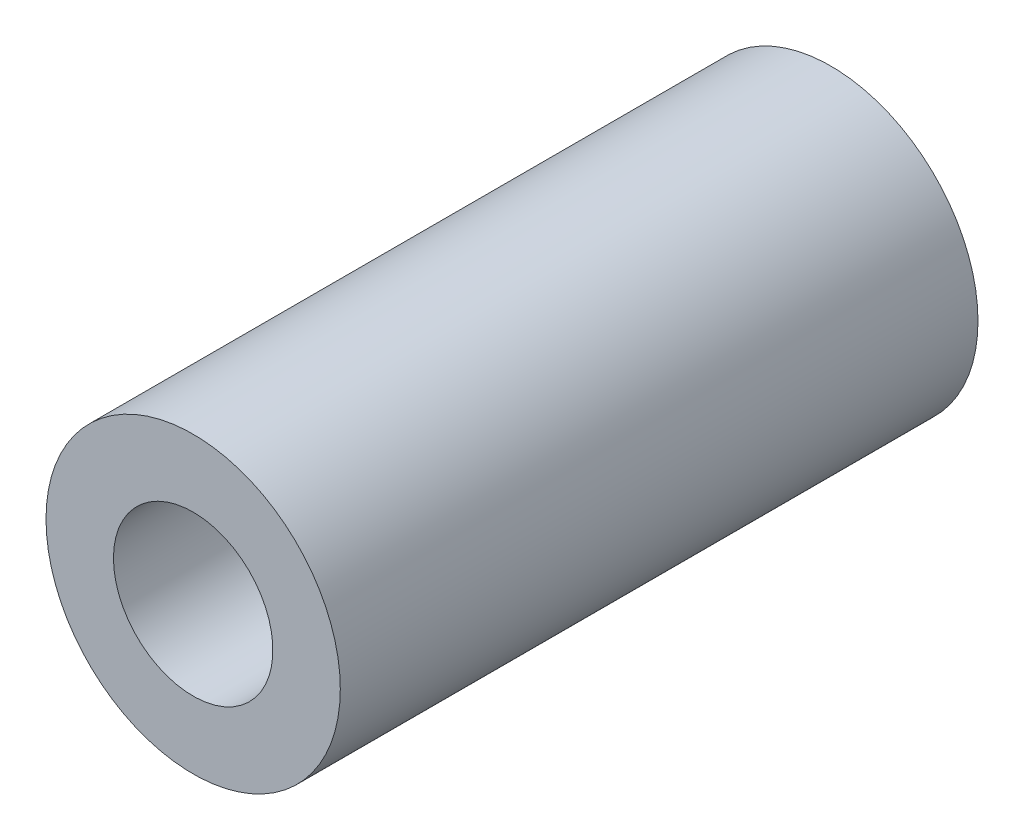
ISO-10303-21;
HEADER;
FILE_DESCRIPTION(('STEP AP214'),'2;1');
FILE_NAME('part.step','',(''),(''),'','','');
FILE_SCHEMA(('AUTOMOTIVE_DESIGN { 1 0 10303 214 1 1 1 1 }'));
ENDSEC;
DATA;
#1=APPLICATION_CONTEXT('core data for automotive mechanical design processes');
#2=APPLICATION_PROTOCOL_DEFINITION('international standard','automotive_design',2000,#1);
#3=PRODUCT_CONTEXT('',#1,'mechanical');
#4=PRODUCT('Part','Part','',(#3));
#5=PRODUCT_RELATED_PRODUCT_CATEGORY('part','',(#4));
#6=PRODUCT_DEFINITION_FORMATION('','',#4);
#7=PRODUCT_DEFINITION_CONTEXT('part definition',#1,'design');
#8=PRODUCT_DEFINITION('design','',#6,#7);
#9=PRODUCT_DEFINITION_SHAPE('','',#8);
#10=(LENGTH_UNIT() NAMED_UNIT(*) SI_UNIT(.MILLI.,.METRE.));
#11=(NAMED_UNIT(*) PLANE_ANGLE_UNIT() SI_UNIT($,.RADIAN.));
#12=(NAMED_UNIT(*) SI_UNIT($,.STERADIAN.) SOLID_ANGLE_UNIT());
#13=UNCERTAINTY_MEASURE_WITH_UNIT(LENGTH_MEASURE(1.E-05),#10,'distance_accuracy_value','');
#14=(GEOMETRIC_REPRESENTATION_CONTEXT(3) GLOBAL_UNCERTAINTY_ASSIGNED_CONTEXT((#13)) GLOBAL_UNIT_ASSIGNED_CONTEXT((#10,
#11,#12)) REPRESENTATION_CONTEXT('',''));
#15=CARTESIAN_POINT('',(0.,0.,0.));
#16=DIRECTION('',(0.,0.,1.));
#17=DIRECTION('',(1.,0.,0.));
#18=AXIS2_PLACEMENT_3D('',#15,#16,#17);
#19=CARTESIAN_POINT('',(0.,0.,26.));
#20=DIRECTION('',(0.,0.,1.));
#21=DIRECTION('',(1.,0.,0.));
#22=AXIS2_PLACEMENT_3D('',#19,#20,#21);
#23=PLANE('',#22);
#24=CARTESIAN_POINT('',(0.,0.,26.));
#25=DIRECTION('',(0.,0.,1.));
#26=DIRECTION('',(1.,0.,0.));
#27=AXIS2_PLACEMENT_3D('',#24,#25,#26);
#28=CIRCLE('',#27,6.);
#29=CARTESIAN_POINT('',(-6.,0.,26.));
#30=VERTEX_POINT('',#29);
#31=EDGE_CURVE('E10',#30,#30,#28,.T.);
#32=ORIENTED_EDGE('',*,*,#31,.T.);
#33=EDGE_LOOP('',(#32));
#34=FACE_BOUND('',#33,.T.);
#35=CARTESIAN_POINT('',(0.,0.,26.));
#36=DIRECTION('',(0.,0.,1.));
#37=DIRECTION('',(1.,0.,0.));
#38=AXIS2_PLACEMENT_3D('',#35,#36,#37);
#39=CIRCLE('',#38,3.25);
#40=CARTESIAN_POINT('',(-3.25,0.,26.));
#41=VERTEX_POINT('',#40);
#42=EDGE_CURVE('E41',#41,#41,#39,.T.);
#43=ORIENTED_EDGE('',*,*,#42,.F.);
#44=EDGE_LOOP('',(#43));
#45=FACE_BOUND('',#44,.T.);
#46=ADVANCED_FACE('F30',(#34,#45),#23,.T.);
#47=CARTESIAN_POINT('',(0.,0.,0.));
#48=DIRECTION('',(0.,0.,1.));
#49=DIRECTION('',(1.,0.,0.));
#50=AXIS2_PLACEMENT_3D('',#47,#48,#49);
#51=PLANE('',#50);
#52=CARTESIAN_POINT('',(0.,0.,0.));
#53=DIRECTION('',(0.,0.,1.));
#54=DIRECTION('',(1.,0.,0.));
#55=AXIS2_PLACEMENT_3D('',#52,#53,#54);
#56=CIRCLE('',#55,6.);
#57=CARTESIAN_POINT('',(-6.,0.,0.));
#58=VERTEX_POINT('',#57);
#59=EDGE_CURVE('E34',#58,#58,#56,.T.);
#60=ORIENTED_EDGE('',*,*,#59,.F.);
#61=EDGE_LOOP('',(#60));
#62=FACE_BOUND('',#61,.T.);
#63=CARTESIAN_POINT('',(0.,0.,0.));
#64=DIRECTION('',(0.,0.,1.));
#65=DIRECTION('',(1.,0.,0.));
#66=AXIS2_PLACEMENT_3D('',#63,#64,#65);
#67=CIRCLE('',#66,3.25);
#68=CARTESIAN_POINT('',(-3.25,0.,0.));
#69=VERTEX_POINT('',#68);
#70=EDGE_CURVE('E43',#69,#69,#67,.T.);
#71=ORIENTED_EDGE('',*,*,#70,.T.);
#72=EDGE_LOOP('',(#71));
#73=FACE_BOUND('',#72,.T.);
#74=ADVANCED_FACE('F53',(#62,#73),#51,.F.);
#75=CARTESIAN_POINT('',(0.,0.,26.));
#76=DIRECTION('',(0.,0.,-1.));
#77=DIRECTION('',(-1.,0.,0.));
#78=AXIS2_PLACEMENT_3D('',#75,#76,#77);
#79=CYLINDRICAL_SURFACE('',#78,6.);
#80=CARTESIAN_POINT('',(-6.,0.,26.));
#81=CARTESIAN_POINT('',(-6.,0.,25.7291666666667));
#82=CARTESIAN_POINT('',(-6.,0.,25.4583333333333));
#83=CARTESIAN_POINT('',(-6.,0.,24.9166666666667));
#84=CARTESIAN_POINT('',(-6.,0.,24.6458333333333));
#85=CARTESIAN_POINT('',(-6.,0.,24.1041666666667));
#86=CARTESIAN_POINT('',(-6.,0.,23.8333333333333));
#87=CARTESIAN_POINT('',(-6.,0.,23.2916666666667));
#88=CARTESIAN_POINT('',(-6.,0.,23.0208333333333));
#89=CARTESIAN_POINT('',(-6.,0.,22.4791666666667));
#90=CARTESIAN_POINT('',(-6.,0.,22.2083333333333));
#91=CARTESIAN_POINT('',(-6.,0.,21.6666666666667));
#92=CARTESIAN_POINT('',(-6.,0.,21.3958333333333));
#93=CARTESIAN_POINT('',(-6.,0.,20.8541666666667));
#94=CARTESIAN_POINT('',(-6.,0.,20.5833333333333));
#95=CARTESIAN_POINT('',(-6.,0.,20.0416666666667));
#96=CARTESIAN_POINT('',(-6.,0.,19.7708333333333));
#97=CARTESIAN_POINT('',(-6.,0.,19.2291666666667));
#98=CARTESIAN_POINT('',(-6.,0.,18.9583333333333));
#99=CARTESIAN_POINT('',(-6.,0.,18.4166666666667));
#100=CARTESIAN_POINT('',(-6.,0.,18.1458333333333));
#101=CARTESIAN_POINT('',(-6.,0.,17.6041666666667));
#102=CARTESIAN_POINT('',(-6.,0.,17.3333333333333));
#103=CARTESIAN_POINT('',(-6.,0.,16.7916666666667));
#104=CARTESIAN_POINT('',(-6.,0.,16.5208333333333));
#105=CARTESIAN_POINT('',(-6.,0.,15.9791666666667));
#106=CARTESIAN_POINT('',(-6.,0.,15.7083333333333));
#107=CARTESIAN_POINT('',(-6.,0.,15.1666666666667));
#108=CARTESIAN_POINT('',(-6.,0.,14.8958333333333));
#109=CARTESIAN_POINT('',(-6.,0.,14.3541666666667));
#110=CARTESIAN_POINT('',(-6.,0.,14.0833333333333));
#111=CARTESIAN_POINT('',(-6.,0.,13.5416666666667));
#112=CARTESIAN_POINT('',(-6.,0.,13.2708333333333));
#113=CARTESIAN_POINT('',(-6.,0.,12.7291666666667));
#114=CARTESIAN_POINT('',(-6.,0.,12.4583333333333));
#115=CARTESIAN_POINT('',(-6.,0.,11.9166666666667));
#116=CARTESIAN_POINT('',(-6.,0.,11.6458333333333));
#117=CARTESIAN_POINT('',(-6.,0.,11.1041666666667));
#118=CARTESIAN_POINT('',(-6.,0.,10.8333333333333));
#119=CARTESIAN_POINT('',(-6.,0.,10.2916666666667));
#120=CARTESIAN_POINT('',(-6.,0.,10.0208333333333));
#121=CARTESIAN_POINT('',(-6.,0.,9.47916666666667));
#122=CARTESIAN_POINT('',(-6.,0.,9.20833333333333));
#123=CARTESIAN_POINT('',(-6.,0.,8.66666666666667));
#124=CARTESIAN_POINT('',(-6.,0.,8.39583333333333));
#125=CARTESIAN_POINT('',(-6.,0.,7.85416666666667));
#126=CARTESIAN_POINT('',(-6.,0.,7.58333333333333));
#127=CARTESIAN_POINT('',(-6.,0.,7.04166666666667));
#128=CARTESIAN_POINT('',(-6.,0.,6.77083333333333));
#129=CARTESIAN_POINT('',(-6.,0.,6.22916666666667));
#130=CARTESIAN_POINT('',(-6.,0.,5.95833333333333));
#131=CARTESIAN_POINT('',(-6.,0.,5.41666666666667));
#132=CARTESIAN_POINT('',(-6.,0.,5.14583333333333));
#133=CARTESIAN_POINT('',(-6.,0.,4.60416666666667));
#134=CARTESIAN_POINT('',(-6.,0.,4.33333333333333));
#135=CARTESIAN_POINT('',(-6.,0.,3.79166666666667));
#136=CARTESIAN_POINT('',(-6.,0.,3.52083333333333));
#137=CARTESIAN_POINT('',(-6.,0.,2.97916666666667));
#138=CARTESIAN_POINT('',(-6.,0.,2.70833333333333));
#139=CARTESIAN_POINT('',(-6.,0.,2.16666666666667));
#140=CARTESIAN_POINT('',(-6.,0.,1.89583333333333));
#141=CARTESIAN_POINT('',(-6.,0.,1.35416666666667));
#142=CARTESIAN_POINT('',(-6.,0.,1.08333333333333));
#143=CARTESIAN_POINT('',(-6.,0.,0.541666666666667));
#144=CARTESIAN_POINT('',(-6.,0.,0.270833333333334));
#145=CARTESIAN_POINT('',(-6.,0.,0.));
#146=B_SPLINE_CURVE_WITH_KNOTS('',3,(#80,#81,#82,#83,#84,#85,#86,#87,#88,#89,#90,#91,#92,#93,
#94,#95,#96,#97,#98,#99,#100,#101,#102,#103,#104,#105,#106,#107,#108,#109,#110,#111,#112,#113,
#114,#115,#116,#117,#118,#119,#120,#121,#122,#123,#124,#125,#126,#127,#128,#129,#130,#131,#132,
#133,#134,#135,#136,#137,#138,#139,#140,#141,#142,#143,#144,#145),.UNSPECIFIED.,.F.,.F.,(4,2,2,
2,2,2,2,2,2,2,2,2,2,2,2,2,2,2,2,2,2,2,2,2,2,2,2,2,2,2,2,2,4),(0.,0.812499999999997,1.625,2.4375,
3.25,4.0625,4.875,5.6875,6.5,7.3125,8.125,8.93749999999999,9.74999999999999,10.5625,11.375,
12.1875,13.,13.8125,14.625,15.4375,16.25,17.0625,17.875,18.6875,19.5,20.3125,21.125,21.9375,
22.75,23.5625,24.375,25.1875,26.),.UNSPECIFIED.);
#147=EDGE_CURVE('BSEAM32',#30,#58,#146,.T.);
#148=ORIENTED_EDGE('',*,*,#31,.F.);
#149=ORIENTED_EDGE('',*,*,#59,.T.);
#150=ORIENTED_EDGE('',*,*,#147,.T.);
#151=ORIENTED_EDGE('',*,*,#147,.F.);
#152=EDGE_LOOP('',(#148,#150,#149,#151));
#153=FACE_BOUND('',#152,.T.);
#154=ADVANCED_FACE('F32',(#153),#79,.T.);
#155=CARTESIAN_POINT('',(0.,0.,26.));
#156=DIRECTION('',(0.,0.,-1.));
#157=DIRECTION('',(-1.,0.,0.));
#158=AXIS2_PLACEMENT_3D('',#155,#156,#157);
#159=CYLINDRICAL_SURFACE('',#158,3.25);
#160=CARTESIAN_POINT('',(-3.25,0.,26.));
#161=CARTESIAN_POINT('',(-3.25,0.,25.7291666666667));
#162=CARTESIAN_POINT('',(-3.25,0.,25.4583333333333));
#163=CARTESIAN_POINT('',(-3.25,0.,24.9166666666667));
#164=CARTESIAN_POINT('',(-3.25,0.,24.6458333333333));
#165=CARTESIAN_POINT('',(-3.25,0.,24.1041666666667));
#166=CARTESIAN_POINT('',(-3.25,0.,23.8333333333333));
#167=CARTESIAN_POINT('',(-3.25,0.,23.2916666666667));
#168=CARTESIAN_POINT('',(-3.25,0.,23.0208333333333));
#169=CARTESIAN_POINT('',(-3.25,0.,22.4791666666667));
#170=CARTESIAN_POINT('',(-3.25,0.,22.2083333333333));
#171=CARTESIAN_POINT('',(-3.25,0.,21.6666666666667));
#172=CARTESIAN_POINT('',(-3.25,0.,21.3958333333333));
#173=CARTESIAN_POINT('',(-3.25,0.,20.8541666666667));
#174=CARTESIAN_POINT('',(-3.25,0.,20.5833333333333));
#175=CARTESIAN_POINT('',(-3.25,0.,20.0416666666667));
#176=CARTESIAN_POINT('',(-3.25,0.,19.7708333333333));
#177=CARTESIAN_POINT('',(-3.25,0.,19.2291666666667));
#178=CARTESIAN_POINT('',(-3.25,0.,18.9583333333333));
#179=CARTESIAN_POINT('',(-3.25,0.,18.4166666666667));
#180=CARTESIAN_POINT('',(-3.25,0.,18.1458333333333));
#181=CARTESIAN_POINT('',(-3.25,0.,17.6041666666667));
#182=CARTESIAN_POINT('',(-3.25,0.,17.3333333333333));
#183=CARTESIAN_POINT('',(-3.25,0.,16.7916666666667));
#184=CARTESIAN_POINT('',(-3.25,0.,16.5208333333333));
#185=CARTESIAN_POINT('',(-3.25,0.,15.9791666666667));
#186=CARTESIAN_POINT('',(-3.25,0.,15.7083333333333));
#187=CARTESIAN_POINT('',(-3.25,0.,15.1666666666667));
#188=CARTESIAN_POINT('',(-3.25,0.,14.8958333333333));
#189=CARTESIAN_POINT('',(-3.25,0.,14.3541666666667));
#190=CARTESIAN_POINT('',(-3.25,0.,14.0833333333333));
#191=CARTESIAN_POINT('',(-3.25,0.,13.5416666666667));
#192=CARTESIAN_POINT('',(-3.25,0.,13.2708333333333));
#193=CARTESIAN_POINT('',(-3.25,0.,12.7291666666667));
#194=CARTESIAN_POINT('',(-3.25,0.,12.4583333333333));
#195=CARTESIAN_POINT('',(-3.25,0.,11.9166666666667));
#196=CARTESIAN_POINT('',(-3.25,0.,11.6458333333333));
#197=CARTESIAN_POINT('',(-3.25,0.,11.1041666666667));
#198=CARTESIAN_POINT('',(-3.25,0.,10.8333333333333));
#199=CARTESIAN_POINT('',(-3.25,0.,10.2916666666667));
#200=CARTESIAN_POINT('',(-3.25,0.,10.0208333333333));
#201=CARTESIAN_POINT('',(-3.25,0.,9.47916666666667));
#202=CARTESIAN_POINT('',(-3.25,0.,9.20833333333333));
#203=CARTESIAN_POINT('',(-3.25,0.,8.66666666666667));
#204=CARTESIAN_POINT('',(-3.25,0.,8.39583333333333));
#205=CARTESIAN_POINT('',(-3.25,0.,7.85416666666667));
#206=CARTESIAN_POINT('',(-3.25,0.,7.58333333333333));
#207=CARTESIAN_POINT('',(-3.25,0.,7.04166666666667));
#208=CARTESIAN_POINT('',(-3.25,0.,6.77083333333333));
#209=CARTESIAN_POINT('',(-3.25,0.,6.22916666666667));
#210=CARTESIAN_POINT('',(-3.25,0.,5.95833333333333));
#211=CARTESIAN_POINT('',(-3.25,0.,5.41666666666667));
#212=CARTESIAN_POINT('',(-3.25,0.,5.14583333333333));
#213=CARTESIAN_POINT('',(-3.25,0.,4.60416666666667));
#214=CARTESIAN_POINT('',(-3.25,0.,4.33333333333333));
#215=CARTESIAN_POINT('',(-3.25,0.,3.79166666666667));
#216=CARTESIAN_POINT('',(-3.25,0.,3.52083333333333));
#217=CARTESIAN_POINT('',(-3.25,0.,2.97916666666667));
#218=CARTESIAN_POINT('',(-3.25,0.,2.70833333333333));
#219=CARTESIAN_POINT('',(-3.25,0.,2.16666666666667));
#220=CARTESIAN_POINT('',(-3.25,0.,1.89583333333333));
#221=CARTESIAN_POINT('',(-3.25,0.,1.35416666666667));
#222=CARTESIAN_POINT('',(-3.25,0.,1.08333333333333));
#223=CARTESIAN_POINT('',(-3.25,0.,0.541666666666667));
#224=CARTESIAN_POINT('',(-3.25,0.,0.270833333333334));
#225=CARTESIAN_POINT('',(-3.25,0.,0.));
#226=B_SPLINE_CURVE_WITH_KNOTS('',3,(#160,#161,#162,#163,#164,#165,#166,#167,#168,#169,#170,
#171,#172,#173,#174,#175,#176,#177,#178,#179,#180,#181,#182,#183,#184,#185,#186,#187,#188,#189,
#190,#191,#192,#193,#194,#195,#196,#197,#198,#199,#200,#201,#202,#203,#204,#205,#206,#207,#208,
#209,#210,#211,#212,#213,#214,#215,#216,#217,#218,#219,#220,#221,#222,#223,#224,#225),
.UNSPECIFIED.,.F.,.F.,(4,2,2,2,2,2,2,2,2,2,2,2,2,2,2,2,2,2,2,2,2,2,2,2,2,2,2,2,2,2,2,2,4),(0.,
0.812499999999997,1.625,2.4375,3.25,4.0625,4.875,5.6875,6.5,7.3125,8.125,8.93749999999999,
9.74999999999999,10.5625,11.375,12.1875,13.,13.8125,14.625,15.4375,16.25,17.0625,17.875,18.6875,
19.5,20.3125,21.125,21.9375,22.75,23.5625,24.375,25.1875,26.),.UNSPECIFIED.);
#227=EDGE_CURVE('BSEAM49',#41,#69,#226,.T.);
#228=ORIENTED_EDGE('',*,*,#42,.T.);
#229=ORIENTED_EDGE('',*,*,#70,.F.);
#230=ORIENTED_EDGE('',*,*,#227,.T.);
#231=ORIENTED_EDGE('',*,*,#227,.F.);
#232=EDGE_LOOP('',(#228,#230,#229,#231));
#233=FACE_BOUND('',#232,.T.);
#234=ADVANCED_FACE('F49',(#233),#159,.F.);
#235=CLOSED_SHELL('',(#46,#74,#154,#234));
#236=MANIFOLD_SOLID_BREP('B2',#235);
#237=ADVANCED_BREP_SHAPE_REPRESENTATION('',(#18,#236),#14);
#238=SHAPE_DEFINITION_REPRESENTATION(#9,#237);
ENDSEC;
END-ISO-10303-21;
